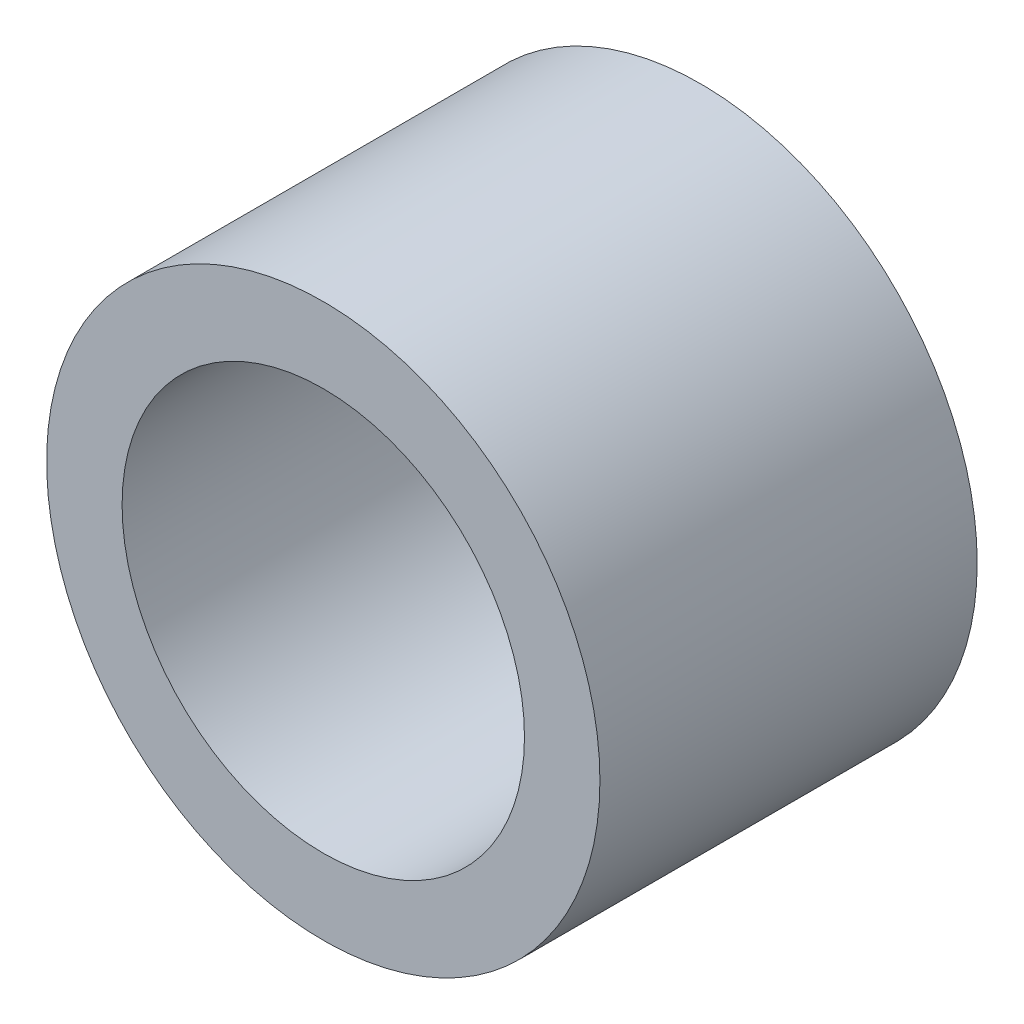
ISO-10303-21;
HEADER;
FILE_DESCRIPTION(('STEP AP214'),'2;1');
FILE_NAME('part.step','',(''),(''),'','','');
FILE_SCHEMA(('AUTOMOTIVE_DESIGN { 1 0 10303 214 1 1 1 1 }'));
ENDSEC;
DATA;
#1=APPLICATION_CONTEXT('core data for automotive mechanical design processes');
#2=APPLICATION_PROTOCOL_DEFINITION('international standard','automotive_design',2000,#1);
#3=PRODUCT_CONTEXT('',#1,'mechanical');
#4=PRODUCT('Part','Part','',(#3));
#5=PRODUCT_RELATED_PRODUCT_CATEGORY('part','',(#4));
#6=PRODUCT_DEFINITION_FORMATION('','',#4);
#7=PRODUCT_DEFINITION_CONTEXT('part definition',#1,'design');
#8=PRODUCT_DEFINITION('design','',#6,#7);
#9=PRODUCT_DEFINITION_SHAPE('','',#8);
#10=(LENGTH_UNIT() NAMED_UNIT(*) SI_UNIT(.MILLI.,.METRE.));
#11=(NAMED_UNIT(*) PLANE_ANGLE_UNIT() SI_UNIT($,.RADIAN.));
#12=(NAMED_UNIT(*) SI_UNIT($,.STERADIAN.) SOLID_ANGLE_UNIT());
#13=UNCERTAINTY_MEASURE_WITH_UNIT(LENGTH_MEASURE(1.E-05),#10,'distance_accuracy_value','');
#14=(GEOMETRIC_REPRESENTATION_CONTEXT(3) GLOBAL_UNCERTAINTY_ASSIGNED_CONTEXT((#13)) GLOBAL_UNIT_ASSIGNED_CONTEXT((#10,
#11,#12)) REPRESENTATION_CONTEXT('',''));
#15=CARTESIAN_POINT('',(0.,0.,0.));
#16=DIRECTION('',(0.,0.,1.));
#17=DIRECTION('',(1.,0.,0.));
#18=AXIS2_PLACEMENT_3D('',#15,#16,#17);
#19=CARTESIAN_POINT('',(0.,0.,15.));
#20=DIRECTION('',(0.,0.,1.));
#21=DIRECTION('',(1.,0.,0.));
#22=AXIS2_PLACEMENT_3D('',#19,#20,#21);
#23=PLANE('',#22);
#24=CARTESIAN_POINT('',(0.,0.,15.));
#25=DIRECTION('',(0.,0.,1.));
#26=DIRECTION('',(1.,0.,0.));
#27=AXIS2_PLACEMENT_3D('',#24,#25,#26);
#28=CIRCLE('',#27,11.);
#29=CARTESIAN_POINT('',(11.,0.,15.));
#30=VERTEX_POINT('',#29);
#31=EDGE_CURVE('E10',#30,#30,#28,.T.);
#32=ORIENTED_EDGE('',*,*,#31,.T.);
#33=EDGE_LOOP('',(#32));
#34=FACE_BOUND('',#33,.T.);
#35=CARTESIAN_POINT('',(0.,0.,15.));
#36=DIRECTION('',(0.,0.,1.));
#37=DIRECTION('',(1.,0.,0.));
#38=AXIS2_PLACEMENT_3D('',#35,#36,#37);
#39=CIRCLE('',#38,8.);
#40=CARTESIAN_POINT('',(8.,0.,15.));
#41=VERTEX_POINT('',#40);
#42=EDGE_CURVE('E42',#41,#41,#39,.T.);
#43=ORIENTED_EDGE('',*,*,#42,.F.);
#44=EDGE_LOOP('',(#43));
#45=FACE_BOUND('',#44,.T.);
#46=ADVANCED_FACE('F31',(#34,#45),#23,.T.);
#47=CARTESIAN_POINT('',(0.,0.,0.));
#48=DIRECTION('',(0.,0.,1.));
#49=DIRECTION('',(1.,0.,0.));
#50=AXIS2_PLACEMENT_3D('',#47,#48,#49);
#51=PLANE('',#50);
#52=CARTESIAN_POINT('',(0.,0.,0.));
#53=DIRECTION('',(0.,0.,1.));
#54=DIRECTION('',(1.,0.,0.));
#55=AXIS2_PLACEMENT_3D('',#52,#53,#54);
#56=CIRCLE('',#55,11.);
#57=CARTESIAN_POINT('',(11.,0.,0.));
#58=VERTEX_POINT('',#57);
#59=EDGE_CURVE('E35',#58,#58,#56,.T.);
#60=ORIENTED_EDGE('',*,*,#59,.F.);
#61=EDGE_LOOP('',(#60));
#62=FACE_BOUND('',#61,.T.);
#63=CARTESIAN_POINT('',(0.,0.,0.));
#64=DIRECTION('',(0.,0.,1.));
#65=DIRECTION('',(1.,0.,0.));
#66=AXIS2_PLACEMENT_3D('',#63,#64,#65);
#67=CIRCLE('',#66,8.);
#68=CARTESIAN_POINT('',(8.,0.,0.));
#69=VERTEX_POINT('',#68);
#70=EDGE_CURVE('E44',#69,#69,#67,.T.);
#71=ORIENTED_EDGE('',*,*,#70,.T.);
#72=EDGE_LOOP('',(#71));
#73=FACE_BOUND('',#72,.T.);
#74=ADVANCED_FACE('F54',(#62,#73),#51,.F.);
#75=CARTESIAN_POINT('',(0.,0.,15.));
#76=DIRECTION('',(0.,0.,-1.));
#77=DIRECTION('',(-1.,0.,0.));
#78=AXIS2_PLACEMENT_3D('',#75,#76,#77);
#79=CYLINDRICAL_SURFACE('',#78,11.);
#80=ORIENTED_EDGE('',*,*,#31,.F.);
#81=EDGE_LOOP('',(#80));
#82=FACE_BOUND('',#81,.T.);
#83=ORIENTED_EDGE('',*,*,#59,.T.);
#84=EDGE_LOOP('',(#83));
#85=FACE_BOUND('',#84,.T.);
#86=ADVANCED_FACE('F33',(#82,#85),#79,.T.);
#87=CARTESIAN_POINT('',(0.,0.,15.));
#88=DIRECTION('',(0.,0.,-1.));
#89=DIRECTION('',(-1.,0.,0.));
#90=AXIS2_PLACEMENT_3D('',#87,#88,#89);
#91=CYLINDRICAL_SURFACE('',#90,8.);
#92=ORIENTED_EDGE('',*,*,#42,.T.);
#93=EDGE_LOOP('',(#92));
#94=FACE_BOUND('',#93,.T.);
#95=ORIENTED_EDGE('',*,*,#70,.F.);
#96=EDGE_LOOP('',(#95));
#97=FACE_BOUND('',#96,.T.);
#98=ADVANCED_FACE('F50',(#94,#97),#91,.F.);
#99=CLOSED_SHELL('',(#46,#74,#86,#98));
#100=MANIFOLD_SOLID_BREP('B2',#99);
#101=ADVANCED_BREP_SHAPE_REPRESENTATION('',(#18,#100),#14);
#102=SHAPE_DEFINITION_REPRESENTATION(#9,#101);
ENDSEC;
END-ISO-10303-21;
